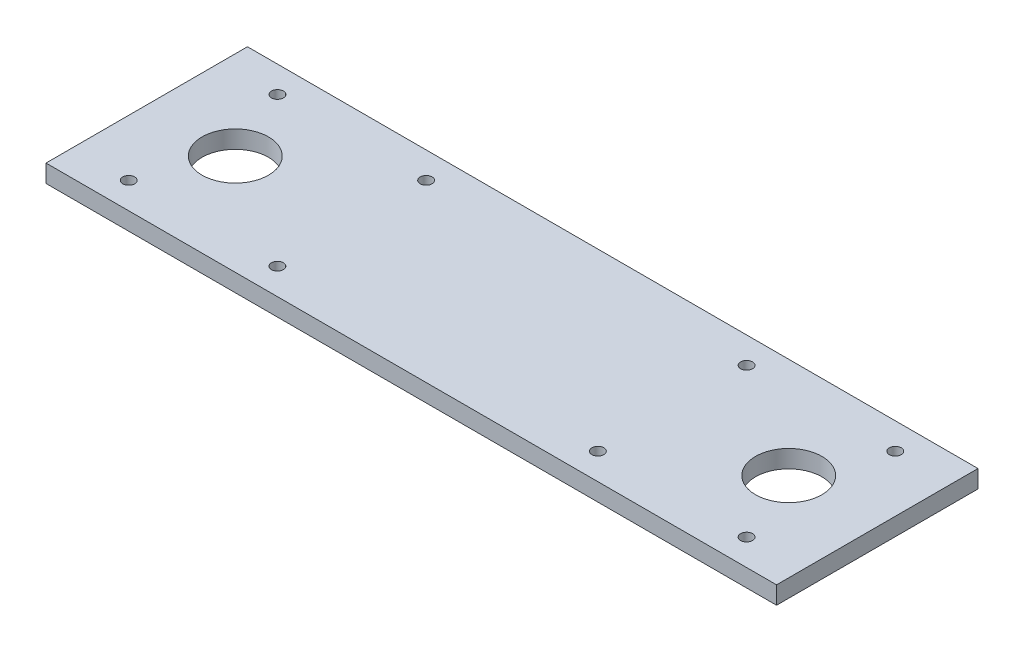
ISO-10303-21;
HEADER;
FILE_DESCRIPTION(('STEP AP214'),'2;1');
FILE_NAME('part.step','',(''),(''),'','','');
FILE_SCHEMA(('AUTOMOTIVE_DESIGN { 1 0 10303 214 1 1 1 1 }'));
ENDSEC;
DATA;
#1=APPLICATION_CONTEXT('core data for automotive mechanical design processes');
#2=APPLICATION_PROTOCOL_DEFINITION('international standard','automotive_design',2000,#1);
#3=PRODUCT_CONTEXT('',#1,'mechanical');
#4=PRODUCT('Part','Part','',(#3));
#5=PRODUCT_RELATED_PRODUCT_CATEGORY('part','',(#4));
#6=PRODUCT_DEFINITION_FORMATION('','',#4);
#7=PRODUCT_DEFINITION_CONTEXT('part definition',#1,'design');
#8=PRODUCT_DEFINITION('design','',#6,#7);
#9=PRODUCT_DEFINITION_SHAPE('','',#8);
#10=(LENGTH_UNIT() NAMED_UNIT(*) SI_UNIT(.MILLI.,.METRE.));
#11=(NAMED_UNIT(*) PLANE_ANGLE_UNIT() SI_UNIT($,.RADIAN.));
#12=(NAMED_UNIT(*) SI_UNIT($,.STERADIAN.) SOLID_ANGLE_UNIT());
#13=UNCERTAINTY_MEASURE_WITH_UNIT(LENGTH_MEASURE(1.E-05),#10,'distance_accuracy_value','');
#14=(GEOMETRIC_REPRESENTATION_CONTEXT(3) GLOBAL_UNCERTAINTY_ASSIGNED_CONTEXT((#13)) GLOBAL_UNIT_ASSIGNED_CONTEXT((#10,
#11,#12)) REPRESENTATION_CONTEXT('',''));
#15=CARTESIAN_POINT('',(0.,0.,0.));
#16=DIRECTION('',(0.,0.,1.));
#17=DIRECTION('',(1.,0.,0.));
#18=AXIS2_PLACEMENT_3D('',#15,#16,#17);
#19=CARTESIAN_POINT('',(165.,8.,45.5));
#20=DIRECTION('',(-1.,0.,0.));
#21=DIRECTION('',(0.,0.,1.));
#22=AXIS2_PLACEMENT_3D('',#19,#20,#21);
#23=PLANE('',#22);
#24=DIRECTION('',(0.,0.,-1.));
#25=VECTOR('',#24,1.);
#26=CARTESIAN_POINT('',(165.,0.,45.5));
#27=LINE('',#26,#25);
#28=CARTESIAN_POINT('',(165.,0.,45.5));
#29=VERTEX_POINT('',#28);
#30=CARTESIAN_POINT('',(165.,0.,-45.5));
#31=VERTEX_POINT('',#30);
#32=EDGE_CURVE('E105',#29,#31,#27,.T.);
#33=ORIENTED_EDGE('',*,*,#32,.T.);
#34=DIRECTION('',(0.,-1.,0.));
#35=VECTOR('',#34,1.);
#36=CARTESIAN_POINT('',(165.,8.,-45.5));
#37=LINE('',#36,#35);
#38=CARTESIAN_POINT('',(165.,8.,-45.5));
#39=VERTEX_POINT('',#38);
#40=EDGE_CURVE('E11',#39,#31,#37,.T.);
#41=ORIENTED_EDGE('',*,*,#40,.F.);
#42=DIRECTION('',(0.,0.,-1.));
#43=VECTOR('',#42,1.);
#44=CARTESIAN_POINT('',(165.,8.,45.5));
#45=LINE('',#44,#43);
#46=CARTESIAN_POINT('',(165.,8.,45.5));
#47=VERTEX_POINT('',#46);
#48=EDGE_CURVE('E89',#47,#39,#45,.T.);
#49=ORIENTED_EDGE('',*,*,#48,.F.);
#50=DIRECTION('',(0.,-1.,0.));
#51=VECTOR('',#50,1.);
#52=CARTESIAN_POINT('',(165.,8.,45.5));
#53=LINE('',#52,#51);
#54=EDGE_CURVE('E98',#47,#29,#53,.T.);
#55=ORIENTED_EDGE('',*,*,#54,.T.);
#56=EDGE_LOOP('',(#33,#41,#49,#55));
#57=FACE_BOUND('',#56,.T.);
#58=ADVANCED_FACE('F39',(#57),#23,.F.);
#59=CARTESIAN_POINT('',(-165.,8.,-45.5));
#60=DIRECTION('',(0.,0.,1.));
#61=DIRECTION('',(1.,0.,0.));
#62=AXIS2_PLACEMENT_3D('',#59,#60,#61);
#63=PLANE('',#62);
#64=DIRECTION('',(-1.,0.,0.));
#65=VECTOR('',#64,1.);
#66=CARTESIAN_POINT('',(-165.,0.,-45.5));
#67=LINE('',#66,#65);
#68=CARTESIAN_POINT('',(-165.,0.,-45.5));
#69=VERTEX_POINT('',#68);
#70=EDGE_CURVE('E94',#31,#69,#67,.T.);
#71=ORIENTED_EDGE('',*,*,#70,.T.);
#72=DIRECTION('',(0.,-1.,0.));
#73=VECTOR('',#72,1.);
#74=CARTESIAN_POINT('',(-165.,8.,-45.5));
#75=LINE('',#74,#73);
#76=CARTESIAN_POINT('',(-165.,8.,-45.5));
#77=VERTEX_POINT('',#76);
#78=EDGE_CURVE('E50',#77,#69,#75,.T.);
#79=ORIENTED_EDGE('',*,*,#78,.F.);
#80=DIRECTION('',(-1.,0.,0.));
#81=VECTOR('',#80,1.);
#82=CARTESIAN_POINT('',(-165.,8.,-45.5));
#83=LINE('',#82,#81);
#84=EDGE_CURVE('E81',#39,#77,#83,.T.);
#85=ORIENTED_EDGE('',*,*,#84,.F.);
#86=ORIENTED_EDGE('',*,*,#40,.T.);
#87=EDGE_LOOP('',(#71,#79,#85,#86));
#88=FACE_BOUND('',#87,.T.);
#89=ADVANCED_FACE('F91',(#88),#63,.F.);
#90=CARTESIAN_POINT('',(-165.,8.,45.5));
#91=DIRECTION('',(1.,0.,0.));
#92=DIRECTION('',(0.,0.,-1.));
#93=AXIS2_PLACEMENT_3D('',#90,#91,#92);
#94=PLANE('',#93);
#95=DIRECTION('',(0.,0.,1.));
#96=VECTOR('',#95,1.);
#97=CARTESIAN_POINT('',(-165.,0.,45.5));
#98=LINE('',#97,#96);
#99=CARTESIAN_POINT('',(-165.,0.,45.5));
#100=VERTEX_POINT('',#99);
#101=EDGE_CURVE('E75',#69,#100,#98,.T.);
#102=ORIENTED_EDGE('',*,*,#101,.T.);
#103=DIRECTION('',(0.,-1.,0.));
#104=VECTOR('',#103,1.);
#105=CARTESIAN_POINT('',(-165.,8.,45.5));
#106=LINE('',#105,#104);
#107=CARTESIAN_POINT('',(-165.,8.,45.5));
#108=VERTEX_POINT('',#107);
#109=EDGE_CURVE('E92',#108,#100,#106,.T.);
#110=ORIENTED_EDGE('',*,*,#109,.F.);
#111=DIRECTION('',(0.,0.,1.));
#112=VECTOR('',#111,1.);
#113=CARTESIAN_POINT('',(-165.,8.,45.5));
#114=LINE('',#113,#112);
#115=EDGE_CURVE('E86',#77,#108,#114,.T.);
#116=ORIENTED_EDGE('',*,*,#115,.F.);
#117=ORIENTED_EDGE('',*,*,#78,.T.);
#118=EDGE_LOOP('',(#102,#110,#116,#117));
#119=FACE_BOUND('',#118,.T.);
#120=ADVANCED_FACE('F96',(#119),#94,.F.);
#121=CARTESIAN_POINT('',(-165.,8.,45.5));
#122=DIRECTION('',(0.,0.,-1.));
#123=DIRECTION('',(-1.,0.,0.));
#124=AXIS2_PLACEMENT_3D('',#121,#122,#123);
#125=PLANE('',#124);
#126=DIRECTION('',(1.,0.,0.));
#127=VECTOR('',#126,1.);
#128=CARTESIAN_POINT('',(-165.,0.,45.5));
#129=LINE('',#128,#127);
#130=EDGE_CURVE('E76',#100,#29,#129,.T.);
#131=ORIENTED_EDGE('',*,*,#130,.T.);
#132=ORIENTED_EDGE('',*,*,#54,.F.);
#133=DIRECTION('',(1.,0.,0.));
#134=VECTOR('',#133,1.);
#135=CARTESIAN_POINT('',(-165.,8.,45.5));
#136=LINE('',#135,#134);
#137=EDGE_CURVE('E54',#108,#47,#136,.T.);
#138=ORIENTED_EDGE('',*,*,#137,.F.);
#139=ORIENTED_EDGE('',*,*,#109,.T.);
#140=EDGE_LOOP('',(#131,#132,#138,#139));
#141=FACE_BOUND('',#140,.T.);
#142=ADVANCED_FACE('F109',(#141),#125,.F.);
#143=CARTESIAN_POINT('',(0.,8.,0.));
#144=DIRECTION('',(0.,-1.,0.));
#145=DIRECTION('',(0.,0.,-1.));
#146=AXIS2_PLACEMENT_3D('',#143,#144,#145);
#147=PLANE('',#146);
#148=CARTESIAN_POINT('',(-72.3700000000001,8.,-33.59));
#149=DIRECTION('',(0.,1.,0.));
#150=DIRECTION('',(0.,0.,1.));
#151=AXIS2_PLACEMENT_3D('',#148,#149,#150);
#152=CIRCLE('',#151,2.7);
#153=CARTESIAN_POINT('',(-72.3700000000001,8.,-30.89));
#154=VERTEX_POINT('',#153);
#155=EDGE_CURVE('E127',#154,#154,#152,.T.);
#156=ORIENTED_EDGE('',*,*,#155,.F.);
#157=EDGE_LOOP('',(#156));
#158=FACE_BOUND('',#157,.T.);
#159=CARTESIAN_POINT('',(139.55,8.,33.59));
#160=DIRECTION('',(0.,1.,0.));
#161=DIRECTION('',(0.,0.,-1.));
#162=AXIS2_PLACEMENT_3D('',#159,#160,#161);
#163=CIRCLE('',#162,2.70000000000001);
#164=CARTESIAN_POINT('',(139.55,8.,30.8899999999999));
#165=VERTEX_POINT('',#164);
#166=EDGE_CURVE('E149',#165,#165,#163,.T.);
#167=ORIENTED_EDGE('',*,*,#166,.F.);
#168=EDGE_LOOP('',(#167));
#169=FACE_BOUND('',#168,.T.);
#170=CARTESIAN_POINT('',(72.37,8.,33.59));
#171=DIRECTION('',(0.,1.,0.));
#172=DIRECTION('',(0.,0.,-1.));
#173=AXIS2_PLACEMENT_3D('',#170,#171,#172);
#174=CIRCLE('',#173,2.7);
#175=CARTESIAN_POINT('',(72.37,8.,30.89));
#176=VERTEX_POINT('',#175);
#177=EDGE_CURVE('E147',#176,#176,#174,.T.);
#178=ORIENTED_EDGE('',*,*,#177,.F.);
#179=EDGE_LOOP('',(#178));
#180=FACE_BOUND('',#179,.T.);
#181=CARTESIAN_POINT('',(72.37,8.,-33.59));
#182=DIRECTION('',(0.,1.,0.));
#183=DIRECTION('',(0.,0.,-1.));
#184=AXIS2_PLACEMENT_3D('',#181,#182,#183);
#185=CIRCLE('',#184,2.7);
#186=CARTESIAN_POINT('',(72.37,8.,-36.29));
#187=VERTEX_POINT('',#186);
#188=EDGE_CURVE('E161',#187,#187,#185,.T.);
#189=ORIENTED_EDGE('',*,*,#188,.F.);
#190=EDGE_LOOP('',(#189));
#191=FACE_BOUND('',#190,.T.);
#192=CARTESIAN_POINT('',(-72.3700000000001,8.,33.59));
#193=DIRECTION('',(0.,1.,0.));
#194=DIRECTION('',(0.,0.,1.));
#195=AXIS2_PLACEMENT_3D('',#192,#193,#194);
#196=CIRCLE('',#195,2.7);
#197=CARTESIAN_POINT('',(-72.3700000000001,8.,36.29));
#198=VERTEX_POINT('',#197);
#199=EDGE_CURVE('E121',#198,#198,#196,.T.);
#200=ORIENTED_EDGE('',*,*,#199,.F.);
#201=EDGE_LOOP('',(#200));
#202=FACE_BOUND('',#201,.T.);
#203=CARTESIAN_POINT('',(-139.55,8.,33.59));
#204=DIRECTION('',(0.,1.,0.));
#205=DIRECTION('',(0.,0.,1.));
#206=AXIS2_PLACEMENT_3D('',#203,#204,#205);
#207=CIRCLE('',#206,2.70000000000001);
#208=CARTESIAN_POINT('',(-139.55,8.,36.29));
#209=VERTEX_POINT('',#208);
#210=EDGE_CURVE('E135',#209,#209,#207,.T.);
#211=ORIENTED_EDGE('',*,*,#210,.F.);
#212=EDGE_LOOP('',(#211));
#213=FACE_BOUND('',#212,.T.);
#214=CARTESIAN_POINT('',(-139.55,8.,-33.59));
#215=DIRECTION('',(0.,1.,0.));
#216=DIRECTION('',(0.,0.,1.));
#217=AXIS2_PLACEMENT_3D('',#214,#215,#216);
#218=CIRCLE('',#217,2.70000000000001);
#219=CARTESIAN_POINT('',(-139.55,8.,-30.89));
#220=VERTEX_POINT('',#219);
#221=EDGE_CURVE('E137',#220,#220,#218,.T.);
#222=ORIENTED_EDGE('',*,*,#221,.F.);
#223=EDGE_LOOP('',(#222));
#224=FACE_BOUND('',#223,.T.);
#225=CARTESIAN_POINT('',(-125.,8.,0.));
#226=DIRECTION('',(0.,1.,0.));
#227=DIRECTION('',(0.,0.,1.));
#228=AXIS2_PLACEMENT_3D('',#225,#226,#227);
#229=CIRCLE('',#228,15.);
#230=CARTESIAN_POINT('',(-125.,8.,15.));
#231=VERTEX_POINT('',#230);
#232=EDGE_CURVE('E117',#231,#231,#229,.T.);
#233=ORIENTED_EDGE('',*,*,#232,.F.);
#234=EDGE_LOOP('',(#233));
#235=FACE_BOUND('',#234,.T.);
#236=CARTESIAN_POINT('',(139.55,8.,-33.59));
#237=DIRECTION('',(0.,1.,0.));
#238=DIRECTION('',(0.,0.,-1.));
#239=AXIS2_PLACEMENT_3D('',#236,#237,#238);
#240=CIRCLE('',#239,2.70000000000001);
#241=CARTESIAN_POINT('',(139.55,8.,-36.29));
#242=VERTEX_POINT('',#241);
#243=EDGE_CURVE('E165',#242,#242,#240,.T.);
#244=ORIENTED_EDGE('',*,*,#243,.F.);
#245=EDGE_LOOP('',(#244));
#246=FACE_BOUND('',#245,.T.);
#247=CARTESIAN_POINT('',(125.,8.,0.));
#248=DIRECTION('',(0.,1.,0.));
#249=DIRECTION('',(0.,0.,1.));
#250=AXIS2_PLACEMENT_3D('',#247,#248,#249);
#251=CIRCLE('',#250,15.);
#252=CARTESIAN_POINT('',(125.,8.,15.));
#253=VERTEX_POINT('',#252);
#254=EDGE_CURVE('E118',#253,#253,#251,.T.);
#255=ORIENTED_EDGE('',*,*,#254,.F.);
#256=EDGE_LOOP('',(#255));
#257=FACE_BOUND('',#256,.T.);
#258=ORIENTED_EDGE('',*,*,#48,.T.);
#259=ORIENTED_EDGE('',*,*,#84,.T.);
#260=ORIENTED_EDGE('',*,*,#115,.T.);
#261=ORIENTED_EDGE('',*,*,#137,.T.);
#262=EDGE_LOOP('',(#258,#259,#260,#261));
#263=FACE_BOUND('',#262,.T.);
#264=ADVANCED_FACE('F88',(#158,#169,#180,#191,#202,#213,#224,#235,#246,#257,#263),#147,.F.);
#265=CARTESIAN_POINT('',(0.,0.,0.));
#266=DIRECTION('',(0.,-1.,0.));
#267=DIRECTION('',(0.,0.,-1.));
#268=AXIS2_PLACEMENT_3D('',#265,#266,#267);
#269=PLANE('',#268);
#270=CARTESIAN_POINT('',(-72.3700000000001,0.,-33.59));
#271=DIRECTION('',(0.,1.,0.));
#272=DIRECTION('',(0.,0.,1.));
#273=AXIS2_PLACEMENT_3D('',#270,#271,#272);
#274=CIRCLE('',#273,2.7);
#275=CARTESIAN_POINT('',(-72.3700000000001,0.,-30.89));
#276=VERTEX_POINT('',#275);
#277=EDGE_CURVE('E153',#276,#276,#274,.T.);
#278=ORIENTED_EDGE('',*,*,#277,.T.);
#279=EDGE_LOOP('',(#278));
#280=FACE_BOUND('',#279,.T.);
#281=CARTESIAN_POINT('',(139.55,0.,33.59));
#282=DIRECTION('',(0.,1.,0.));
#283=DIRECTION('',(0.,0.,-1.));
#284=AXIS2_PLACEMENT_3D('',#281,#282,#283);
#285=CIRCLE('',#284,2.70000000000001);
#286=CARTESIAN_POINT('',(139.55,0.,30.8899999999999));
#287=VERTEX_POINT('',#286);
#288=EDGE_CURVE('E148',#287,#287,#285,.T.);
#289=ORIENTED_EDGE('',*,*,#288,.T.);
#290=EDGE_LOOP('',(#289));
#291=FACE_BOUND('',#290,.T.);
#292=CARTESIAN_POINT('',(72.37,0.,33.59));
#293=DIRECTION('',(0.,1.,0.));
#294=DIRECTION('',(0.,0.,-1.));
#295=AXIS2_PLACEMENT_3D('',#292,#293,#294);
#296=CIRCLE('',#295,2.7);
#297=CARTESIAN_POINT('',(72.37,0.,30.89));
#298=VERTEX_POINT('',#297);
#299=EDGE_CURVE('E164',#298,#298,#296,.T.);
#300=ORIENTED_EDGE('',*,*,#299,.T.);
#301=EDGE_LOOP('',(#300));
#302=FACE_BOUND('',#301,.T.);
#303=CARTESIAN_POINT('',(72.37,0.,-33.59));
#304=DIRECTION('',(0.,1.,0.));
#305=DIRECTION('',(0.,0.,-1.));
#306=AXIS2_PLACEMENT_3D('',#303,#304,#305);
#307=CIRCLE('',#306,2.7);
#308=CARTESIAN_POINT('',(72.37,0.,-36.29));
#309=VERTEX_POINT('',#308);
#310=EDGE_CURVE('E158',#309,#309,#307,.T.);
#311=ORIENTED_EDGE('',*,*,#310,.T.);
#312=EDGE_LOOP('',(#311));
#313=FACE_BOUND('',#312,.T.);
#314=CARTESIAN_POINT('',(-72.3700000000001,0.,33.59));
#315=DIRECTION('',(0.,1.,0.));
#316=DIRECTION('',(0.,0.,1.));
#317=AXIS2_PLACEMENT_3D('',#314,#315,#316);
#318=CIRCLE('',#317,2.7);
#319=CARTESIAN_POINT('',(-72.3700000000001,0.,36.29));
#320=VERTEX_POINT('',#319);
#321=EDGE_CURVE('E124',#320,#320,#318,.T.);
#322=ORIENTED_EDGE('',*,*,#321,.T.);
#323=EDGE_LOOP('',(#322));
#324=FACE_BOUND('',#323,.T.);
#325=CARTESIAN_POINT('',(-139.55,0.,33.59));
#326=DIRECTION('',(0.,1.,0.));
#327=DIRECTION('',(0.,0.,1.));
#328=AXIS2_PLACEMENT_3D('',#325,#326,#327);
#329=CIRCLE('',#328,2.70000000000001);
#330=CARTESIAN_POINT('',(-139.55,0.,36.29));
#331=VERTEX_POINT('',#330);
#332=EDGE_CURVE('E129',#331,#331,#329,.T.);
#333=ORIENTED_EDGE('',*,*,#332,.T.);
#334=EDGE_LOOP('',(#333));
#335=FACE_BOUND('',#334,.T.);
#336=CARTESIAN_POINT('',(-139.55,0.,-33.59));
#337=DIRECTION('',(0.,1.,0.));
#338=DIRECTION('',(0.,0.,1.));
#339=AXIS2_PLACEMENT_3D('',#336,#337,#338);
#340=CIRCLE('',#339,2.70000000000001);
#341=CARTESIAN_POINT('',(-139.55,0.,-30.89));
#342=VERTEX_POINT('',#341);
#343=EDGE_CURVE('E134',#342,#342,#340,.T.);
#344=ORIENTED_EDGE('',*,*,#343,.T.);
#345=EDGE_LOOP('',(#344));
#346=FACE_BOUND('',#345,.T.);
#347=CARTESIAN_POINT('',(-125.,0.,0.));
#348=DIRECTION('',(0.,1.,0.));
#349=DIRECTION('',(0.,0.,1.));
#350=AXIS2_PLACEMENT_3D('',#347,#348,#349);
#351=CIRCLE('',#350,15.);
#352=CARTESIAN_POINT('',(-125.,0.,15.));
#353=VERTEX_POINT('',#352);
#354=EDGE_CURVE('E143',#353,#353,#351,.T.);
#355=ORIENTED_EDGE('',*,*,#354,.T.);
#356=EDGE_LOOP('',(#355));
#357=FACE_BOUND('',#356,.T.);
#358=CARTESIAN_POINT('',(139.55,0.,-33.59));
#359=DIRECTION('',(0.,1.,0.));
#360=DIRECTION('',(0.,0.,-1.));
#361=AXIS2_PLACEMENT_3D('',#358,#359,#360);
#362=CIRCLE('',#361,2.70000000000001);
#363=CARTESIAN_POINT('',(139.55,0.,-36.29));
#364=VERTEX_POINT('',#363);
#365=EDGE_CURVE('E168',#364,#364,#362,.T.);
#366=ORIENTED_EDGE('',*,*,#365,.T.);
#367=EDGE_LOOP('',(#366));
#368=FACE_BOUND('',#367,.T.);
#369=CARTESIAN_POINT('',(125.,0.,0.));
#370=DIRECTION('',(0.,1.,0.));
#371=DIRECTION('',(0.,0.,1.));
#372=AXIS2_PLACEMENT_3D('',#369,#370,#371);
#373=CIRCLE('',#372,15.);
#374=CARTESIAN_POINT('',(125.,0.,15.));
#375=VERTEX_POINT('',#374);
#376=EDGE_CURVE('E104',#375,#375,#373,.T.);
#377=ORIENTED_EDGE('',*,*,#376,.T.);
#378=EDGE_LOOP('',(#377));
#379=FACE_BOUND('',#378,.T.);
#380=ORIENTED_EDGE('',*,*,#32,.F.);
#381=ORIENTED_EDGE('',*,*,#130,.F.);
#382=ORIENTED_EDGE('',*,*,#101,.F.);
#383=ORIENTED_EDGE('',*,*,#70,.F.);
#384=EDGE_LOOP('',(#380,#381,#382,#383));
#385=FACE_BOUND('',#384,.T.);
#386=ADVANCED_FACE('F114',(#280,#291,#302,#313,#324,#335,#346,#357,#368,#379,#385),#269,.T.);
#387=CARTESIAN_POINT('',(125.,0.,0.));
#388=DIRECTION('',(0.,1.,0.));
#389=DIRECTION('',(0.,0.,1.));
#390=AXIS2_PLACEMENT_3D('',#387,#388,#389);
#391=CYLINDRICAL_SURFACE('',#390,15.);
#392=ORIENTED_EDGE('',*,*,#376,.F.);
#393=EDGE_LOOP('',(#392));
#394=FACE_BOUND('',#393,.T.);
#395=ORIENTED_EDGE('',*,*,#254,.T.);
#396=EDGE_LOOP('',(#395));
#397=FACE_BOUND('',#396,.T.);
#398=ADVANCED_FACE('F184',(#394,#397),#391,.F.);
#399=CARTESIAN_POINT('',(139.55,0.,-33.59));
#400=DIRECTION('',(0.,1.,0.));
#401=DIRECTION('',(0.,0.,1.));
#402=AXIS2_PLACEMENT_3D('',#399,#400,#401);
#403=CYLINDRICAL_SURFACE('',#402,2.70000000000001);
#404=ORIENTED_EDGE('',*,*,#365,.F.);
#405=EDGE_LOOP('',(#404));
#406=FACE_BOUND('',#405,.T.);
#407=ORIENTED_EDGE('',*,*,#243,.T.);
#408=EDGE_LOOP('',(#407));
#409=FACE_BOUND('',#408,.T.);
#410=ADVANCED_FACE('F178',(#406,#409),#403,.F.);
#411=CARTESIAN_POINT('',(-125.,0.,0.));
#412=DIRECTION('',(0.,1.,0.));
#413=DIRECTION('',(0.,0.,1.));
#414=AXIS2_PLACEMENT_3D('',#411,#412,#413);
#415=CYLINDRICAL_SURFACE('',#414,15.);
#416=ORIENTED_EDGE('',*,*,#354,.F.);
#417=EDGE_LOOP('',(#416));
#418=FACE_BOUND('',#417,.T.);
#419=ORIENTED_EDGE('',*,*,#232,.T.);
#420=EDGE_LOOP('',(#419));
#421=FACE_BOUND('',#420,.T.);
#422=ADVANCED_FACE('F194',(#418,#421),#415,.F.);
#423=CARTESIAN_POINT('',(-139.55,0.,-33.59));
#424=DIRECTION('',(0.,1.,0.));
#425=DIRECTION('',(0.,0.,1.));
#426=AXIS2_PLACEMENT_3D('',#423,#424,#425);
#427=CYLINDRICAL_SURFACE('',#426,2.70000000000001);
#428=ORIENTED_EDGE('',*,*,#343,.F.);
#429=EDGE_LOOP('',(#428));
#430=FACE_BOUND('',#429,.T.);
#431=ORIENTED_EDGE('',*,*,#221,.T.);
#432=EDGE_LOOP('',(#431));
#433=FACE_BOUND('',#432,.T.);
#434=ADVANCED_FACE('F241',(#430,#433),#427,.F.);
#435=CARTESIAN_POINT('',(-139.55,0.,33.59));
#436=DIRECTION('',(0.,1.,0.));
#437=DIRECTION('',(0.,0.,1.));
#438=AXIS2_PLACEMENT_3D('',#435,#436,#437);
#439=CYLINDRICAL_SURFACE('',#438,2.70000000000001);
#440=ORIENTED_EDGE('',*,*,#332,.F.);
#441=EDGE_LOOP('',(#440));
#442=FACE_BOUND('',#441,.T.);
#443=ORIENTED_EDGE('',*,*,#210,.T.);
#444=EDGE_LOOP('',(#443));
#445=FACE_BOUND('',#444,.T.);
#446=ADVANCED_FACE('F251',(#442,#445),#439,.F.);
#447=CARTESIAN_POINT('',(-72.3700000000001,0.,33.59));
#448=DIRECTION('',(0.,1.,0.));
#449=DIRECTION('',(0.,0.,1.));
#450=AXIS2_PLACEMENT_3D('',#447,#448,#449);
#451=CYLINDRICAL_SURFACE('',#450,2.7);
#452=ORIENTED_EDGE('',*,*,#321,.F.);
#453=EDGE_LOOP('',(#452));
#454=FACE_BOUND('',#453,.T.);
#455=ORIENTED_EDGE('',*,*,#199,.T.);
#456=EDGE_LOOP('',(#455));
#457=FACE_BOUND('',#456,.T.);
#458=ADVANCED_FACE('F263',(#454,#457),#451,.F.);
#459=CARTESIAN_POINT('',(72.37,0.,-33.59));
#460=DIRECTION('',(0.,1.,0.));
#461=DIRECTION('',(0.,0.,1.));
#462=AXIS2_PLACEMENT_3D('',#459,#460,#461);
#463=CYLINDRICAL_SURFACE('',#462,2.7);
#464=ORIENTED_EDGE('',*,*,#310,.F.);
#465=EDGE_LOOP('',(#464));
#466=FACE_BOUND('',#465,.T.);
#467=ORIENTED_EDGE('',*,*,#188,.T.);
#468=EDGE_LOOP('',(#467));
#469=FACE_BOUND('',#468,.T.);
#470=ADVANCED_FACE('F272',(#466,#469),#463,.F.);
#471=CARTESIAN_POINT('',(72.37,0.,33.59));
#472=DIRECTION('',(0.,1.,0.));
#473=DIRECTION('',(0.,0.,1.));
#474=AXIS2_PLACEMENT_3D('',#471,#472,#473);
#475=CYLINDRICAL_SURFACE('',#474,2.7);
#476=ORIENTED_EDGE('',*,*,#299,.F.);
#477=EDGE_LOOP('',(#476));
#478=FACE_BOUND('',#477,.T.);
#479=ORIENTED_EDGE('',*,*,#177,.T.);
#480=EDGE_LOOP('',(#479));
#481=FACE_BOUND('',#480,.T.);
#482=ADVANCED_FACE('F285',(#478,#481),#475,.F.);
#483=CARTESIAN_POINT('',(139.55,0.,33.59));
#484=DIRECTION('',(0.,1.,0.));
#485=DIRECTION('',(0.,0.,1.));
#486=AXIS2_PLACEMENT_3D('',#483,#484,#485);
#487=CYLINDRICAL_SURFACE('',#486,2.70000000000001);
#488=ORIENTED_EDGE('',*,*,#288,.F.);
#489=EDGE_LOOP('',(#488));
#490=FACE_BOUND('',#489,.T.);
#491=ORIENTED_EDGE('',*,*,#166,.T.);
#492=EDGE_LOOP('',(#491));
#493=FACE_BOUND('',#492,.T.);
#494=ADVANCED_FACE('F295',(#490,#493),#487,.F.);
#495=CARTESIAN_POINT('',(-72.3700000000001,0.,-33.59));
#496=DIRECTION('',(0.,1.,0.));
#497=DIRECTION('',(0.,0.,1.));
#498=AXIS2_PLACEMENT_3D('',#495,#496,#497);
#499=CYLINDRICAL_SURFACE('',#498,2.7);
#500=ORIENTED_EDGE('',*,*,#277,.F.);
#501=EDGE_LOOP('',(#500));
#502=FACE_BOUND('',#501,.T.);
#503=ORIENTED_EDGE('',*,*,#155,.T.);
#504=EDGE_LOOP('',(#503));
#505=FACE_BOUND('',#504,.T.);
#506=ADVANCED_FACE('F304',(#502,#505),#499,.F.);
#507=CLOSED_SHELL('',(#58,#89,#120,#142,#264,#386,#398,#410,#422,#434,#446,#458,#470,#482,#494,#506));
#508=MANIFOLD_SOLID_BREP('B2',#507);
#509=ADVANCED_BREP_SHAPE_REPRESENTATION('',(#18,#508),#14);
#510=SHAPE_DEFINITION_REPRESENTATION(#9,#509);
ENDSEC;
END-ISO-10303-21;
